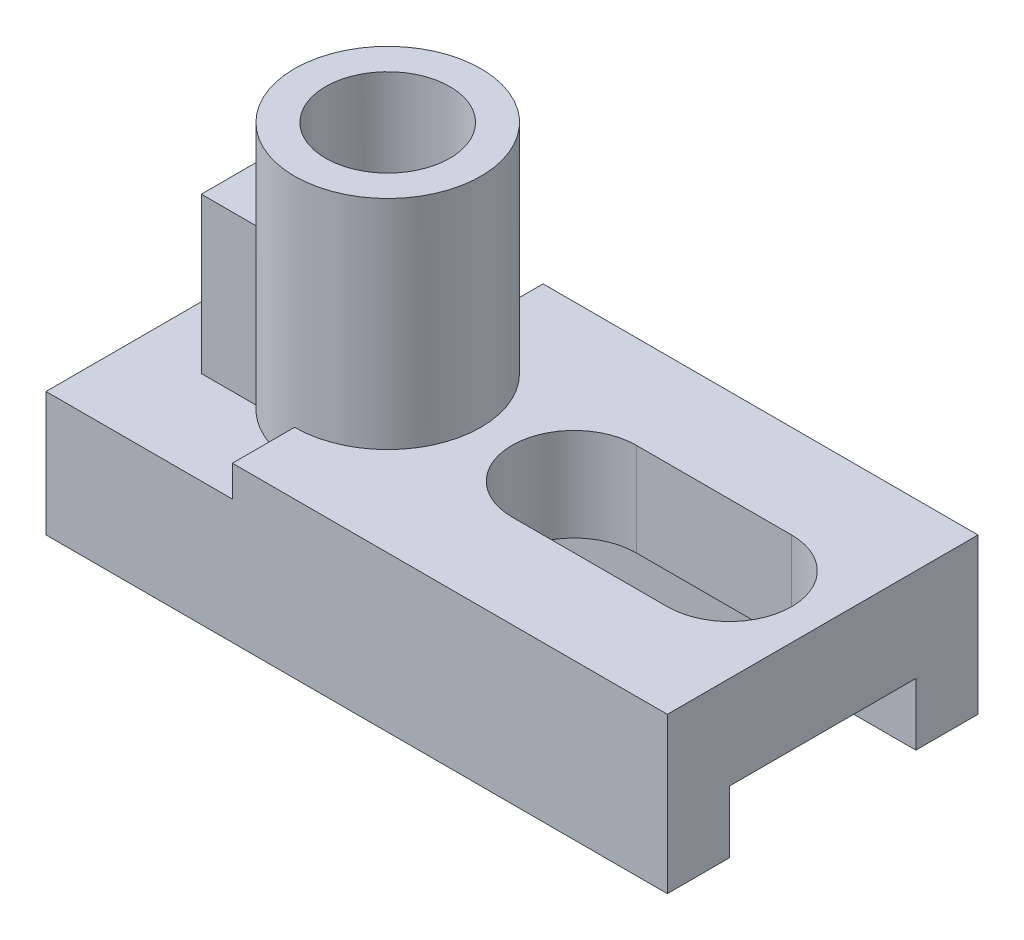
ISO-10303-21;
HEADER;
FILE_DESCRIPTION(('STEP AP214'),'2;1');
FILE_NAME('part.step','',(''),(''),'','','');
FILE_SCHEMA(('AUTOMOTIVE_DESIGN { 1 0 10303 214 1 1 1 1 }'));
ENDSEC;
DATA;
#1=APPLICATION_CONTEXT('core data for automotive mechanical design processes');
#2=APPLICATION_PROTOCOL_DEFINITION('international standard','automotive_design',2000,#1);
#3=PRODUCT_CONTEXT('',#1,'mechanical');
#4=PRODUCT('Part','Part','',(#3));
#5=PRODUCT_RELATED_PRODUCT_CATEGORY('part','',(#4));
#6=PRODUCT_DEFINITION_FORMATION('','',#4);
#7=PRODUCT_DEFINITION_CONTEXT('part definition',#1,'design');
#8=PRODUCT_DEFINITION('design','',#6,#7);
#9=PRODUCT_DEFINITION_SHAPE('','',#8);
#10=(LENGTH_UNIT() NAMED_UNIT(*) SI_UNIT(.MILLI.,.METRE.));
#11=(NAMED_UNIT(*) PLANE_ANGLE_UNIT() SI_UNIT($,.RADIAN.));
#12=(NAMED_UNIT(*) SI_UNIT($,.STERADIAN.) SOLID_ANGLE_UNIT());
#13=UNCERTAINTY_MEASURE_WITH_UNIT(LENGTH_MEASURE(1.E-05),#10,'distance_accuracy_value','');
#14=(GEOMETRIC_REPRESENTATION_CONTEXT(3) GLOBAL_UNCERTAINTY_ASSIGNED_CONTEXT((#13)) GLOBAL_UNIT_ASSIGNED_CONTEXT((#10,
#11,#12)) REPRESENTATION_CONTEXT('',''));
#15=CARTESIAN_POINT('',(0.,0.,0.));
#16=DIRECTION('',(0.,0.,1.));
#17=DIRECTION('',(1.,0.,0.));
#18=AXIS2_PLACEMENT_3D('',#15,#16,#17);
#19=CARTESIAN_POINT('',(30.,25.,25.));
#20=DIRECTION('',(1.,0.,0.));
#21=DIRECTION('',(0.,1.,0.));
#22=AXIS2_PLACEMENT_3D('',#19,#20,#21);
#23=PLANE('',#22);
#24=DIRECTION('',(0.,-1.,0.));
#25=VECTOR('',#24,1.);
#26=CARTESIAN_POINT('',(30.,60.,15.));
#27=LINE('',#26,#25);
#28=CARTESIAN_POINT('',(30.,20.,15.));
#29=VERTEX_POINT('',#28);
#30=CARTESIAN_POINT('',(30.,25.,15.));
#31=VERTEX_POINT('',#30);
#32=EDGE_CURVE('E350',#29,#31,#27,.F.);
#33=ORIENTED_EDGE('',*,*,#32,.F.);
#34=DIRECTION('',(0.,0.,-1.));
#35=VECTOR('',#34,1.);
#36=CARTESIAN_POINT('',(30.,20.,25.));
#37=LINE('',#36,#35);
#38=CARTESIAN_POINT('',(30.,20.,25.));
#39=VERTEX_POINT('',#38);
#40=EDGE_CURVE('E299',#39,#29,#37,.T.);
#41=ORIENTED_EDGE('',*,*,#40,.F.);
#42=DIRECTION('',(0.,-1.,0.));
#43=VECTOR('',#42,1.);
#44=CARTESIAN_POINT('',(30.,25.,25.));
#45=LINE('',#44,#43);
#46=CARTESIAN_POINT('',(30.,25.,25.));
#47=VERTEX_POINT('',#46);
#48=EDGE_CURVE('E324',#47,#39,#45,.T.);
#49=ORIENTED_EDGE('',*,*,#48,.F.);
#50=DIRECTION('',(0.,0.,-1.));
#51=VECTOR('',#50,1.);
#52=CARTESIAN_POINT('',(30.,25.,25.));
#53=LINE('',#52,#51);
#54=EDGE_CURVE('E293',#47,#31,#53,.T.);
#55=ORIENTED_EDGE('',*,*,#54,.T.);
#56=EDGE_LOOP('',(#33,#41,#49,#55));
#57=FACE_BOUND('',#56,.T.);
#58=ADVANCED_FACE('F41',(#57),#23,.F.);
#59=DIRECTION('',(0.,-1.,0.));
#60=VECTOR('',#59,1.);
#61=CARTESIAN_POINT('',(30.,60.,-15.));
#62=LINE('',#61,#60);
#63=CARTESIAN_POINT('',(30.,25.,-15.));
#64=VERTEX_POINT('',#63);
#65=CARTESIAN_POINT('',(30.,20.,-15.));
#66=VERTEX_POINT('',#65);
#67=EDGE_CURVE('E362',#64,#66,#62,.T.);
#68=ORIENTED_EDGE('',*,*,#67,.F.);
#69=CARTESIAN_POINT('',(30.,25.,-25.));
#70=VERTEX_POINT('',#69);
#71=EDGE_CURVE('E298',#64,#70,#53,.T.);
#72=ORIENTED_EDGE('',*,*,#71,.T.);
#73=DIRECTION('',(0.,-1.,0.));
#74=VECTOR('',#73,1.);
#75=CARTESIAN_POINT('',(30.,25.,-25.));
#76=LINE('',#75,#74);
#77=CARTESIAN_POINT('',(30.,20.,-25.));
#78=VERTEX_POINT('',#77);
#79=EDGE_CURVE('E310',#70,#78,#76,.T.);
#80=ORIENTED_EDGE('',*,*,#79,.T.);
#81=EDGE_CURVE('E302',#66,#78,#37,.T.);
#82=ORIENTED_EDGE('',*,*,#81,.F.);
#83=EDGE_LOOP('',(#68,#72,#80,#82));
#84=FACE_BOUND('',#83,.T.);
#85=ADVANCED_FACE('F246',(#84),#23,.F.);
#86=CARTESIAN_POINT('',(0.,0.,25.));
#87=DIRECTION('',(0.,1.,0.));
#88=DIRECTION('',(0.,0.,1.));
#89=AXIS2_PLACEMENT_3D('',#86,#87,#88);
#90=PLANE('',#89);
#91=DIRECTION('',(0.,0.,-1.));
#92=VECTOR('',#91,1.);
#93=CARTESIAN_POINT('',(100.,0.,25.));
#94=LINE('',#93,#92);
#95=CARTESIAN_POINT('',(100.,0.,-15.));
#96=VERTEX_POINT('',#95);
#97=CARTESIAN_POINT('',(100.,0.,-25.));
#98=VERTEX_POINT('',#97);
#99=EDGE_CURVE('E282',#96,#98,#94,.T.);
#100=ORIENTED_EDGE('',*,*,#99,.F.);
#101=DIRECTION('',(-1.,0.,0.));
#102=VECTOR('',#101,1.);
#103=CARTESIAN_POINT('',(100.,0.,-15.));
#104=LINE('',#103,#102);
#105=CARTESIAN_POINT('',(0.,0.,-15.));
#106=VERTEX_POINT('',#105);
#107=EDGE_CURVE('E283',#96,#106,#104,.T.);
#108=ORIENTED_EDGE('',*,*,#107,.T.);
#109=DIRECTION('',(0.,0.,-1.));
#110=VECTOR('',#109,1.);
#111=CARTESIAN_POINT('',(0.,0.,25.));
#112=LINE('',#111,#110);
#113=CARTESIAN_POINT('',(0.,0.,-25.));
#114=VERTEX_POINT('',#113);
#115=EDGE_CURVE('E49',#106,#114,#112,.T.);
#116=ORIENTED_EDGE('',*,*,#115,.T.);
#117=DIRECTION('',(1.,0.,0.));
#118=VECTOR('',#117,1.);
#119=CARTESIAN_POINT('',(0.,0.,-25.));
#120=LINE('',#119,#118);
#121=EDGE_CURVE('E286',#114,#98,#120,.T.);
#122=ORIENTED_EDGE('',*,*,#121,.T.);
#123=EDGE_LOOP('',(#100,#108,#116,#122));
#124=FACE_BOUND('',#123,.T.);
#125=ADVANCED_FACE('F253',(#124),#90,.F.);
#126=CARTESIAN_POINT('',(0.,20.,25.));
#127=DIRECTION('',(1.,0.,0.));
#128=DIRECTION('',(0.,1.,0.));
#129=AXIS2_PLACEMENT_3D('',#126,#127,#128);
#130=PLANE('',#129);
#131=ORIENTED_EDGE('',*,*,#115,.F.);
#132=DIRECTION('',(0.,-1.,0.));
#133=VECTOR('',#132,1.);
#134=CARTESIAN_POINT('',(0.,0.,-15.));
#135=LINE('',#134,#133);
#136=CARTESIAN_POINT('',(0.,10.,-15.));
#137=VERTEX_POINT('',#136);
#138=EDGE_CURVE('E348',#137,#106,#135,.T.);
#139=ORIENTED_EDGE('',*,*,#138,.F.);
#140=DIRECTION('',(0.,0.,-1.));
#141=VECTOR('',#140,1.);
#142=CARTESIAN_POINT('',(0.,10.,-15.));
#143=LINE('',#142,#141);
#144=CARTESIAN_POINT('',(0.,10.,15.));
#145=VERTEX_POINT('',#144);
#146=EDGE_CURVE('E341',#145,#137,#143,.T.);
#147=ORIENTED_EDGE('',*,*,#146,.F.);
#148=DIRECTION('',(0.,1.,0.));
#149=VECTOR('',#148,1.);
#150=CARTESIAN_POINT('',(0.,0.,15.));
#151=LINE('',#150,#149);
#152=CARTESIAN_POINT('',(0.,0.,15.));
#153=VERTEX_POINT('',#152);
#154=EDGE_CURVE('E345',#153,#145,#151,.T.);
#155=ORIENTED_EDGE('',*,*,#154,.F.);
#156=CARTESIAN_POINT('',(0.,0.,25.));
#157=VERTEX_POINT('',#156);
#158=EDGE_CURVE('E11',#157,#153,#112,.T.);
#159=ORIENTED_EDGE('',*,*,#158,.F.);
#160=DIRECTION('',(0.,-1.,0.));
#161=VECTOR('',#160,1.);
#162=CARTESIAN_POINT('',(0.,20.,25.));
#163=LINE('',#162,#161);
#164=CARTESIAN_POINT('',(0.,20.,25.));
#165=VERTEX_POINT('',#164);
#166=EDGE_CURVE('E309',#165,#157,#163,.T.);
#167=ORIENTED_EDGE('',*,*,#166,.F.);
#168=DIRECTION('',(0.,0.,-1.));
#169=VECTOR('',#168,1.);
#170=CARTESIAN_POINT('',(0.,20.,25.));
#171=LINE('',#170,#169);
#172=CARTESIAN_POINT('',(0.,20.,-25.));
#173=VERTEX_POINT('',#172);
#174=EDGE_CURVE('E303',#165,#173,#171,.T.);
#175=ORIENTED_EDGE('',*,*,#174,.T.);
#176=DIRECTION('',(0.,-1.,0.));
#177=VECTOR('',#176,1.);
#178=CARTESIAN_POINT('',(0.,20.,-25.));
#179=LINE('',#178,#177);
#180=EDGE_CURVE('E319',#173,#114,#179,.T.);
#181=ORIENTED_EDGE('',*,*,#180,.T.);
#182=EDGE_LOOP('',(#131,#139,#147,#155,#159,#167,#175,#181));
#183=FACE_BOUND('',#182,.T.);
#184=ADVANCED_FACE('F43',(#183),#130,.F.);
#185=ORIENTED_EDGE('',*,*,#158,.T.);
#186=DIRECTION('',(-1.,0.,0.));
#187=VECTOR('',#186,1.);
#188=CARTESIAN_POINT('',(100.,0.,15.));
#189=LINE('',#188,#187);
#190=CARTESIAN_POINT('',(100.,0.,15.));
#191=VERTEX_POINT('',#190);
#192=EDGE_CURVE('E335',#191,#153,#189,.T.);
#193=ORIENTED_EDGE('',*,*,#192,.F.);
#194=CARTESIAN_POINT('',(100.,0.,25.));
#195=VERTEX_POINT('',#194);
#196=EDGE_CURVE('E289',#195,#191,#94,.T.);
#197=ORIENTED_EDGE('',*,*,#196,.F.);
#198=DIRECTION('',(1.,0.,0.));
#199=VECTOR('',#198,1.);
#200=CARTESIAN_POINT('',(0.,0.,25.));
#201=LINE('',#200,#199);
#202=EDGE_CURVE('E330',#157,#195,#201,.T.);
#203=ORIENTED_EDGE('',*,*,#202,.F.);
#204=EDGE_LOOP('',(#185,#193,#197,#203));
#205=FACE_BOUND('',#204,.T.);
#206=ADVANCED_FACE('F266',(#205),#90,.F.);
#207=CARTESIAN_POINT('',(100.,0.,25.));
#208=DIRECTION('',(-1.,0.,0.));
#209=DIRECTION('',(0.,0.,1.));
#210=AXIS2_PLACEMENT_3D('',#207,#208,#209);
#211=PLANE('',#210);
#212=DIRECTION('',(0.,0.,-1.));
#213=VECTOR('',#212,1.);
#214=CARTESIAN_POINT('',(100.,10.,-15.));
#215=LINE('',#214,#213);
#216=CARTESIAN_POINT('',(100.,10.,15.));
#217=VERTEX_POINT('',#216);
#218=CARTESIAN_POINT('',(100.,10.,-15.));
#219=VERTEX_POINT('',#218);
#220=EDGE_CURVE('E336',#217,#219,#215,.T.);
#221=ORIENTED_EDGE('',*,*,#220,.T.);
#222=DIRECTION('',(0.,-1.,0.));
#223=VECTOR('',#222,1.);
#224=CARTESIAN_POINT('',(100.,0.,-15.));
#225=LINE('',#224,#223);
#226=EDGE_CURVE('E344',#219,#96,#225,.T.);
#227=ORIENTED_EDGE('',*,*,#226,.T.);
#228=ORIENTED_EDGE('',*,*,#99,.T.);
#229=DIRECTION('',(0.,1.,0.));
#230=VECTOR('',#229,1.);
#231=CARTESIAN_POINT('',(100.,0.,-25.));
#232=LINE('',#231,#230);
#233=CARTESIAN_POINT('',(100.,25.,-25.));
#234=VERTEX_POINT('',#233);
#235=EDGE_CURVE('E316',#98,#234,#232,.T.);
#236=ORIENTED_EDGE('',*,*,#235,.T.);
#237=DIRECTION('',(0.,0.,-1.));
#238=VECTOR('',#237,1.);
#239=CARTESIAN_POINT('',(100.,25.,25.));
#240=LINE('',#239,#238);
#241=CARTESIAN_POINT('',(100.,25.,25.));
#242=VERTEX_POINT('',#241);
#243=EDGE_CURVE('E290',#242,#234,#240,.T.);
#244=ORIENTED_EDGE('',*,*,#243,.F.);
#245=DIRECTION('',(0.,1.,0.));
#246=VECTOR('',#245,1.);
#247=CARTESIAN_POINT('',(100.,0.,25.));
#248=LINE('',#247,#246);
#249=EDGE_CURVE('E328',#195,#242,#248,.T.);
#250=ORIENTED_EDGE('',*,*,#249,.F.);
#251=ORIENTED_EDGE('',*,*,#196,.T.);
#252=DIRECTION('',(0.,1.,0.));
#253=VECTOR('',#252,1.);
#254=CARTESIAN_POINT('',(100.,0.,15.));
#255=LINE('',#254,#253);
#256=EDGE_CURVE('E353',#191,#217,#255,.T.);
#257=ORIENTED_EDGE('',*,*,#256,.T.);
#258=EDGE_LOOP('',(#221,#227,#228,#236,#244,#250,#251,#257));
#259=FACE_BOUND('',#258,.T.);
#260=ADVANCED_FACE('F263',(#259),#211,.F.);
#261=CARTESIAN_POINT('',(100.,25.,25.));
#262=DIRECTION('',(0.,-1.,0.));
#263=DIRECTION('',(1.,0.,0.));
#264=AXIS2_PLACEMENT_3D('',#261,#262,#263);
#265=PLANE('',#264);
#266=DIRECTION('',(1.,0.,0.));
#267=VECTOR('',#266,1.);
#268=CARTESIAN_POINT('',(60.,25.,10.));
#269=LINE('',#268,#267);
#270=CARTESIAN_POINT('',(60.,25.,10.));
#271=VERTEX_POINT('',#270);
#272=CARTESIAN_POINT('',(85.,25.,10.));
#273=VERTEX_POINT('',#272);
#274=EDGE_CURVE('E200',#271,#273,#269,.T.);
#275=ORIENTED_EDGE('',*,*,#274,.F.);
#276=CARTESIAN_POINT('',(60.,25.,0.));
#277=DIRECTION('',(0.,1.,0.));
#278=DIRECTION('',(-1.,0.,0.));
#279=AXIS2_PLACEMENT_3D('',#276,#277,#278);
#280=CIRCLE('',#279,10.);
#281=CARTESIAN_POINT('',(60.,25.,-10.));
#282=VERTEX_POINT('',#281);
#283=EDGE_CURVE('E56',#282,#271,#280,.T.);
#284=ORIENTED_EDGE('',*,*,#283,.F.);
#285=DIRECTION('',(-1.,0.,0.));
#286=VECTOR('',#285,1.);
#287=CARTESIAN_POINT('',(60.,25.,-10.));
#288=LINE('',#287,#286);
#289=CARTESIAN_POINT('',(85.,25.,-10.));
#290=VERTEX_POINT('',#289);
#291=EDGE_CURVE('E186',#290,#282,#288,.T.);
#292=ORIENTED_EDGE('',*,*,#291,.F.);
#293=CARTESIAN_POINT('',(85.,25.,0.));
#294=DIRECTION('',(0.,1.,0.));
#295=DIRECTION('',(-1.,0.,0.));
#296=AXIS2_PLACEMENT_3D('',#293,#294,#295);
#297=CIRCLE('',#296,10.);
#298=EDGE_CURVE('E206',#273,#290,#297,.T.);
#299=ORIENTED_EDGE('',*,*,#298,.F.);
#300=EDGE_LOOP('',(#275,#284,#292,#299));
#301=FACE_BOUND('',#300,.T.);
#302=CARTESIAN_POINT('',(30.,25.,0.));
#303=DIRECTION('',(0.,-1.,0.));
#304=DIRECTION('',(1.,0.,0.));
#305=AXIS2_PLACEMENT_3D('',#302,#303,#304);
#306=CIRCLE('',#305,15.);
#307=EDGE_CURVE('E359',#31,#64,#306,.F.);
#308=ORIENTED_EDGE('',*,*,#307,.F.);
#309=ORIENTED_EDGE('',*,*,#54,.F.);
#310=DIRECTION('',(-1.,0.,0.));
#311=VECTOR('',#310,1.);
#312=CARTESIAN_POINT('',(100.,25.,25.));
#313=LINE('',#312,#311);
#314=EDGE_CURVE('E326',#242,#47,#313,.T.);
#315=ORIENTED_EDGE('',*,*,#314,.F.);
#316=ORIENTED_EDGE('',*,*,#243,.T.);
#317=DIRECTION('',(-1.,0.,0.));
#318=VECTOR('',#317,1.);
#319=CARTESIAN_POINT('',(100.,25.,-25.));
#320=LINE('',#319,#318);
#321=EDGE_CURVE('E313',#234,#70,#320,.T.);
#322=ORIENTED_EDGE('',*,*,#321,.T.);
#323=ORIENTED_EDGE('',*,*,#71,.F.);
#324=EDGE_LOOP('',(#308,#309,#315,#316,#322,#323));
#325=FACE_BOUND('',#324,.T.);
#326=ADVANCED_FACE('F260',(#301,#325),#265,.F.);
#327=CARTESIAN_POINT('',(30.,20.,25.));
#328=DIRECTION('',(0.,-1.,0.));
#329=DIRECTION('',(1.,0.,0.));
#330=AXIS2_PLACEMENT_3D('',#327,#328,#329);
#331=PLANE('',#330);
#332=DIRECTION('',(0.,0.,1.));
#333=VECTOR('',#332,1.);
#334=CARTESIAN_POINT('',(10.,20.,-10.));
#335=LINE('',#334,#333);
#336=CARTESIAN_POINT('',(10.,20.,-10.));
#337=VERTEX_POINT('',#336);
#338=CARTESIAN_POINT('',(10.,20.,10.));
#339=VERTEX_POINT('',#338);
#340=EDGE_CURVE('E397',#337,#339,#335,.T.);
#341=ORIENTED_EDGE('',*,*,#340,.F.);
#342=DIRECTION('',(-1.,0.,0.));
#343=VECTOR('',#342,1.);
#344=CARTESIAN_POINT('',(100.001,20.,-10.));
#345=LINE('',#344,#343);
#346=CARTESIAN_POINT('',(18.8196601125011,20.,-10.));
#347=VERTEX_POINT('',#346);
#348=EDGE_CURVE('E390',#347,#337,#345,.T.);
#349=ORIENTED_EDGE('',*,*,#348,.F.);
#350=CARTESIAN_POINT('',(30.,20.,0.));
#351=DIRECTION('',(0.,-1.,0.));
#352=DIRECTION('',(1.,0.,0.));
#353=AXIS2_PLACEMENT_3D('',#350,#351,#352);
#354=CIRCLE('',#353,15.);
#355=EDGE_CURVE('E371',#66,#347,#354,.F.);
#356=ORIENTED_EDGE('',*,*,#355,.F.);
#357=ORIENTED_EDGE('',*,*,#81,.T.);
#358=DIRECTION('',(-1.,0.,0.));
#359=VECTOR('',#358,1.);
#360=CARTESIAN_POINT('',(30.,20.,-25.));
#361=LINE('',#360,#359);
#362=EDGE_CURVE('E307',#78,#173,#361,.T.);
#363=ORIENTED_EDGE('',*,*,#362,.T.);
#364=ORIENTED_EDGE('',*,*,#174,.F.);
#365=DIRECTION('',(-1.,0.,0.));
#366=VECTOR('',#365,1.);
#367=CARTESIAN_POINT('',(30.,20.,25.));
#368=LINE('',#367,#366);
#369=EDGE_CURVE('E306',#39,#165,#368,.T.);
#370=ORIENTED_EDGE('',*,*,#369,.F.);
#371=ORIENTED_EDGE('',*,*,#40,.T.);
#372=CARTESIAN_POINT('',(18.8196601125011,20.,9.99999999999999));
#373=VERTEX_POINT('',#372);
#374=EDGE_CURVE('E374',#373,#29,#354,.F.);
#375=ORIENTED_EDGE('',*,*,#374,.F.);
#376=DIRECTION('',(-1.,0.,0.));
#377=VECTOR('',#376,1.);
#378=CARTESIAN_POINT('',(100.001,20.,10.));
#379=LINE('',#378,#377);
#380=EDGE_CURVE('E378',#373,#339,#379,.T.);
#381=ORIENTED_EDGE('',*,*,#380,.T.);
#382=EDGE_LOOP('',(#341,#349,#356,#357,#363,#364,#370,#371,#375,#381));
#383=FACE_BOUND('',#382,.T.);
#384=ADVANCED_FACE('F258',(#383),#331,.F.);
#385=CARTESIAN_POINT('',(0.,0.,25.));
#386=DIRECTION('',(0.,0.,1.));
#387=DIRECTION('',(1.,0.,0.));
#388=AXIS2_PLACEMENT_3D('',#385,#386,#387);
#389=PLANE('',#388);
#390=ORIENTED_EDGE('',*,*,#166,.T.);
#391=ORIENTED_EDGE('',*,*,#202,.T.);
#392=ORIENTED_EDGE('',*,*,#249,.T.);
#393=ORIENTED_EDGE('',*,*,#314,.T.);
#394=ORIENTED_EDGE('',*,*,#48,.T.);
#395=ORIENTED_EDGE('',*,*,#369,.T.);
#396=EDGE_LOOP('',(#390,#391,#392,#393,#394,#395));
#397=FACE_BOUND('',#396,.T.);
#398=ADVANCED_FACE('F435',(#397),#389,.T.);
#399=CARTESIAN_POINT('',(0.,0.,-25.));
#400=DIRECTION('',(0.,0.,1.));
#401=DIRECTION('',(1.,0.,0.));
#402=AXIS2_PLACEMENT_3D('',#399,#400,#401);
#403=PLANE('',#402);
#404=ORIENTED_EDGE('',*,*,#180,.F.);
#405=ORIENTED_EDGE('',*,*,#362,.F.);
#406=ORIENTED_EDGE('',*,*,#79,.F.);
#407=ORIENTED_EDGE('',*,*,#321,.F.);
#408=ORIENTED_EDGE('',*,*,#235,.F.);
#409=ORIENTED_EDGE('',*,*,#121,.F.);
#410=EDGE_LOOP('',(#404,#405,#406,#407,#408,#409));
#411=FACE_BOUND('',#410,.T.);
#412=ADVANCED_FACE('F428',(#411),#403,.F.);
#413=CARTESIAN_POINT('',(100.,0.,-15.));
#414=DIRECTION('',(0.,0.,-1.));
#415=DIRECTION('',(-1.,0.,0.));
#416=AXIS2_PLACEMENT_3D('',#413,#414,#415);
#417=PLANE('',#416);
#418=ORIENTED_EDGE('',*,*,#138,.T.);
#419=ORIENTED_EDGE('',*,*,#107,.F.);
#420=ORIENTED_EDGE('',*,*,#226,.F.);
#421=DIRECTION('',(-1.,0.,0.));
#422=VECTOR('',#421,1.);
#423=CARTESIAN_POINT('',(100.,10.,-15.));
#424=LINE('',#423,#422);
#425=EDGE_CURVE('E322',#219,#137,#424,.T.);
#426=ORIENTED_EDGE('',*,*,#425,.T.);
#427=EDGE_LOOP('',(#418,#419,#420,#426));
#428=FACE_BOUND('',#427,.T.);
#429=ADVANCED_FACE('F468',(#428),#417,.F.);
#430=CARTESIAN_POINT('',(100.,10.,-15.));
#431=DIRECTION('',(0.,1.,0.));
#432=DIRECTION('',(-1.,0.,0.));
#433=AXIS2_PLACEMENT_3D('',#430,#431,#432);
#434=PLANE('',#433);
#435=DIRECTION('',(1.,0.,0.));
#436=VECTOR('',#435,1.);
#437=CARTESIAN_POINT('',(60.,10.,-10.));
#438=LINE('',#437,#436);
#439=CARTESIAN_POINT('',(60.,10.,-10.));
#440=VERTEX_POINT('',#439);
#441=CARTESIAN_POINT('',(85.,10.,-10.));
#442=VERTEX_POINT('',#441);
#443=EDGE_CURVE('E198',#440,#442,#438,.T.);
#444=ORIENTED_EDGE('',*,*,#443,.F.);
#445=CARTESIAN_POINT('',(60.,10.,0.));
#446=DIRECTION('',(0.,1.,0.));
#447=DIRECTION('',(-1.,0.,0.));
#448=AXIS2_PLACEMENT_3D('',#445,#446,#447);
#449=CIRCLE('',#448,10.);
#450=CARTESIAN_POINT('',(60.,10.,10.));
#451=VERTEX_POINT('',#450);
#452=EDGE_CURVE('E180',#451,#440,#449,.F.);
#453=ORIENTED_EDGE('',*,*,#452,.F.);
#454=DIRECTION('',(-1.,0.,0.));
#455=VECTOR('',#454,1.);
#456=CARTESIAN_POINT('',(60.,10.,10.));
#457=LINE('',#456,#455);
#458=CARTESIAN_POINT('',(85.,10.,10.));
#459=VERTEX_POINT('',#458);
#460=EDGE_CURVE('E189',#459,#451,#457,.T.);
#461=ORIENTED_EDGE('',*,*,#460,.F.);
#462=CARTESIAN_POINT('',(85.,10.,0.));
#463=DIRECTION('',(0.,1.,0.));
#464=DIRECTION('',(-1.,0.,0.));
#465=AXIS2_PLACEMENT_3D('',#462,#463,#464);
#466=CIRCLE('',#465,10.);
#467=EDGE_CURVE('E64',#442,#459,#466,.F.);
#468=ORIENTED_EDGE('',*,*,#467,.F.);
#469=EDGE_LOOP('',(#444,#453,#461,#468));
#470=FACE_BOUND('',#469,.T.);
#471=CARTESIAN_POINT('',(30.,10.,0.));
#472=DIRECTION('',(0.,1.,0.));
#473=DIRECTION('',(-1.,0.,0.));
#474=AXIS2_PLACEMENT_3D('',#471,#472,#473);
#475=CIRCLE('',#474,10.);
#476=CARTESIAN_POINT('',(20.,10.,0.));
#477=VERTEX_POINT('',#476);
#478=EDGE_CURVE('E375',#477,#477,#475,.T.);
#479=ORIENTED_EDGE('',*,*,#478,.T.);
#480=EDGE_LOOP('',(#479));
#481=FACE_BOUND('',#480,.T.);
#482=ORIENTED_EDGE('',*,*,#146,.T.);
#483=ORIENTED_EDGE('',*,*,#425,.F.);
#484=ORIENTED_EDGE('',*,*,#220,.F.);
#485=DIRECTION('',(-1.,0.,0.));
#486=VECTOR('',#485,1.);
#487=CARTESIAN_POINT('',(100.,10.,15.));
#488=LINE('',#487,#486);
#489=EDGE_CURVE('E338',#217,#145,#488,.T.);
#490=ORIENTED_EDGE('',*,*,#489,.T.);
#491=EDGE_LOOP('',(#482,#483,#484,#490));
#492=FACE_BOUND('',#491,.T.);
#493=ADVANCED_FACE('F195',(#470,#481,#492),#434,.F.);
#494=CARTESIAN_POINT('',(100.,0.,15.));
#495=DIRECTION('',(0.,0.,1.));
#496=DIRECTION('',(1.,0.,0.));
#497=AXIS2_PLACEMENT_3D('',#494,#495,#496);
#498=PLANE('',#497);
#499=ORIENTED_EDGE('',*,*,#154,.T.);
#500=ORIENTED_EDGE('',*,*,#489,.F.);
#501=ORIENTED_EDGE('',*,*,#256,.F.);
#502=ORIENTED_EDGE('',*,*,#192,.T.);
#503=EDGE_LOOP('',(#499,#500,#501,#502));
#504=FACE_BOUND('',#503,.T.);
#505=ADVANCED_FACE('F464',(#504),#498,.F.);
#506=CARTESIAN_POINT('',(30.,60.,0.));
#507=DIRECTION('',(0.,-1.,0.));
#508=DIRECTION('',(1.,0.,0.));
#509=AXIS2_PLACEMENT_3D('',#506,#507,#508);
#510=CYLINDRICAL_SURFACE('',#509,15.);
#511=CARTESIAN_POINT('',(30.,60.,0.));
#512=DIRECTION('',(0.,1.,0.));
#513=DIRECTION('',(-1.,0.,0.));
#514=AXIS2_PLACEMENT_3D('',#511,#512,#513);
#515=CIRCLE('',#514,15.);
#516=CARTESIAN_POINT('',(15.,60.,0.));
#517=VERTEX_POINT('',#516);
#518=EDGE_CURVE('E365',#517,#517,#515,.T.);
#519=ORIENTED_EDGE('',*,*,#518,.F.);
#520=EDGE_LOOP('',(#519));
#521=FACE_BOUND('',#520,.T.);
#522=ORIENTED_EDGE('',*,*,#355,.T.);
#523=DIRECTION('',(0.,-1.,0.));
#524=VECTOR('',#523,1.);
#525=CARTESIAN_POINT('',(18.819660112501,60.,-10.));
#526=LINE('',#525,#524);
#527=CARTESIAN_POINT('',(18.819660112501,45.,-10.));
#528=VERTEX_POINT('',#527);
#529=EDGE_CURVE('E218',#528,#347,#526,.T.);
#530=ORIENTED_EDGE('',*,*,#529,.F.);
#531=CARTESIAN_POINT('',(30.,45.,0.));
#532=DIRECTION('',(0.,1.,0.));
#533=DIRECTION('',(-1.,0.,0.));
#534=AXIS2_PLACEMENT_3D('',#531,#532,#533);
#535=CIRCLE('',#534,15.);
#536=CARTESIAN_POINT('',(18.819660112501,45.,10.));
#537=VERTEX_POINT('',#536);
#538=EDGE_CURVE('E387',#537,#528,#535,.F.);
#539=ORIENTED_EDGE('',*,*,#538,.F.);
#540=DIRECTION('',(0.,-1.,0.));
#541=VECTOR('',#540,1.);
#542=CARTESIAN_POINT('',(18.819660112501,60.,10.));
#543=LINE('',#542,#541);
#544=EDGE_CURVE('E384',#373,#537,#543,.F.);
#545=ORIENTED_EDGE('',*,*,#544,.F.);
#546=ORIENTED_EDGE('',*,*,#374,.T.);
#547=ORIENTED_EDGE('',*,*,#32,.T.);
#548=ORIENTED_EDGE('',*,*,#307,.T.);
#549=ORIENTED_EDGE('',*,*,#67,.T.);
#550=EDGE_LOOP('',(#522,#530,#539,#545,#546,#547,#548,#549));
#551=FACE_BOUND('',#550,.T.);
#552=ADVANCED_FACE('F417',(#521,#551),#510,.T.);
#553=CARTESIAN_POINT('',(30.,60.,0.));
#554=DIRECTION('',(0.,-1.,0.));
#555=DIRECTION('',(1.,0.,0.));
#556=AXIS2_PLACEMENT_3D('',#553,#554,#555);
#557=CYLINDRICAL_SURFACE('',#556,10.);
#558=CARTESIAN_POINT('',(21.3397459621556,32.5,5.));
#559=CARTESIAN_POINT('',(21.3397451717148,32.6303316567961,4.99999937774203));
#560=CARTESIAN_POINT('',(21.3367936067945,32.7606749083469,4.99489703999514));
#561=CARTESIAN_POINT('',(21.3250978442011,33.0203552182528,4.97455590140419));
#562=CARTESIAN_POINT('',(21.3163509497667,33.1496917797997,4.95931238151411));
#563=CARTESIAN_POINT('',(21.2933708761722,33.4065135375637,4.91885673177676));
#564=CARTESIAN_POINT('',(21.2791290941027,33.533995503785,4.89362896878987));
#565=CARTESIAN_POINT('',(21.2456753377062,33.7860174644883,4.83352579766962));
#566=CARTESIAN_POINT('',(21.2264612023273,33.910556154035,4.79864619425836));
#567=CARTESIAN_POINT('',(21.1625432276779,34.2771112075341,4.6805346614708));
#568=CARTESIAN_POINT('',(21.1114011902248,34.5137323207336,4.58356144574886));
#569=CARTESIAN_POINT('',(20.9978634005828,34.9671619547889,4.35632594214357));
#570=CARTESIAN_POINT('',(20.9354670396361,35.1839694029475,4.22606185336435));
#571=CARTESIAN_POINT('',(20.80015967177,35.6115106177474,3.92334549410418));
#572=CARTESIAN_POINT('',(20.7268058966527,35.8202685823228,3.74829976483493));
#573=CARTESIAN_POINT('',(20.5813917776511,36.2070690515488,3.36622943427775));
#574=CARTESIAN_POINT('',(20.5093320949016,36.3850962349664,3.15918897852744));
#575=CARTESIAN_POINT('',(20.4051555690493,36.6312264286858,2.82033206345808));
#576=CARTESIAN_POINT('',(20.3700644551257,36.7119131521005,2.69838192133586));
#577=CARTESIAN_POINT('',(20.3031984331087,36.8626286654218,2.44722131237054));
#578=CARTESIAN_POINT('',(20.2714222067019,36.9326616973628,2.31801376345376));
#579=CARTESIAN_POINT('',(20.2121047956838,37.0613762312931,2.05317391777884));
#580=CARTESIAN_POINT('',(20.1845625204856,37.1200606574798,1.91754328730049));
#581=CARTESIAN_POINT('',(20.1345275763493,37.2254310158281,1.64079696990288));
#582=CARTESIAN_POINT('',(20.1120343710895,37.2721182224333,1.49968186742446));
#583=CARTESIAN_POINT('',(20.0741964005329,37.3500155125182,1.22330436599561));
#584=CARTESIAN_POINT('',(20.0584570426482,37.3820901096035,1.08833937324157));
#585=CARTESIAN_POINT('',(20.0323842841448,37.4349664286038,0.815709188800226));
#586=CARTESIAN_POINT('',(20.0220503571985,37.4557692480603,0.678044261360672));
#587=CARTESIAN_POINT('',(20.0070909976274,37.4858199114167,0.401217055741373));
#588=CARTESIAN_POINT('',(20.0024628094897,37.4950733329762,0.262055533104025));
#589=CARTESIAN_POINT('',(19.9990431871666,37.5019143333983,-0.016622041628056));
#590=CARTESIAN_POINT('',(20.0002513958802,37.4995026259935,-0.15613807151017));
#591=CARTESIAN_POINT('',(20.0081073689446,37.4837693970487,-0.422158287145504));
#592=CARTESIAN_POINT('',(20.0142712780748,37.4714182292176,-0.548735568605425));
#593=CARTESIAN_POINT('',(20.0312788492895,37.437167427645,-0.80031234857486));
#594=CARTESIAN_POINT('',(20.0421239889958,37.415264778974,-0.925311336065679));
#595=CARTESIAN_POINT('',(20.0682326356399,37.3621537757626,-1.17280363036128));
#596=CARTESIAN_POINT('',(20.0834946645095,37.3309485341379,-1.29529776073402));
#597=CARTESIAN_POINT('',(20.1180784487973,37.2595523484822,-1.53706747687733));
#598=CARTESIAN_POINT('',(20.1374017589985,37.2193579627522,-1.65634181022019));
#599=CARTESIAN_POINT('',(20.2014077760755,37.0846254604358,-2.01140340124727));
#600=CARTESIAN_POINT('',(20.2517737794168,36.9766310411066,-2.24122720645223));
#601=CARTESIAN_POINT('',(20.3631218462743,36.7286703075067,-2.67992393299636));
#602=CARTESIAN_POINT('',(20.4241077086267,36.588692546844,-2.88878931500038));
#603=CARTESIAN_POINT('',(20.5577764311311,36.2655365262267,-3.30085071454948));
#604=CARTESIAN_POINT('',(20.6310200432075,36.0795253968794,-3.50164452019891));
#605=CARTESIAN_POINT('',(20.7772941382291,35.6770108060787,-3.87054772569916));
#606=CARTESIAN_POINT('',(20.8503244150107,35.4604841030917,-4.03863197852248));
#607=CARTESIAN_POINT('',(20.9560908822458,35.1088064627185,-4.2679539578839));
#608=CARTESIAN_POINT('',(20.9917002251846,34.9829490688498,-4.34240098162072));
#609=CARTESIAN_POINT('',(21.0594851604287,34.7244861217296,-4.48030007564995));
#610=CARTESIAN_POINT('',(21.09166219668,34.5918834411214,-4.54375677655288));
#611=CARTESIAN_POINT('',(21.1513936855708,34.3207965096454,-4.65901104656178));
#612=CARTESIAN_POINT('',(21.1789509347442,34.1823158810192,-4.71081567564999));
#613=CARTESIAN_POINT('',(21.2283515576381,33.9003786539485,-4.80217514780264));
#614=CARTESIAN_POINT('',(21.2501957104144,33.7569227369748,-4.84173166119403));
#615=CARTESIAN_POINT('',(21.2857382854019,33.4777430649249,-4.90539138118897));
#616=CARTESIAN_POINT('',(21.2999446715175,33.3423062664424,-4.93047005719824));
#617=CARTESIAN_POINT('',(21.3221178334045,33.0693280921951,-4.96939299432912));
#618=CARTESIAN_POINT('',(21.3300853742938,32.9317869766089,-4.98323863305272));
#619=CARTESIAN_POINT('',(21.3394397976437,32.6558845075408,-4.99947854378905));
#620=CARTESIAN_POINT('',(21.3408304384998,32.51752366777,-5.00187935599941));
#621=CARTESIAN_POINT('',(21.3369807746226,32.2411790950675,-4.99520900229025));
#622=CARTESIAN_POINT('',(21.3317409174746,32.1031953373112,-4.98613861072294));
#623=CARTESIAN_POINT('',(21.315784948067,31.8439119206006,-4.95828928039379));
#624=CARTESIAN_POINT('',(21.3057330086067,31.7224432856653,-4.94068517767344));
#625=CARTESIAN_POINT('',(21.2808950136088,31.4815824240837,-4.89671673345791));
#626=CARTESIAN_POINT('',(21.2661074999668,31.3621908489265,-4.87034969372092));
#627=CARTESIAN_POINT('',(21.2153039257381,31.0082899585571,-4.77850297980869));
#628=CARTESIAN_POINT('',(21.1728354536974,30.7778857081681,-4.7002591459757));
#629=CARTESIAN_POINT('',(21.0731875839911,30.3229067643173,-4.50823244687957));
#630=CARTESIAN_POINT('',(21.0154179457053,30.0990963080479,-4.39297142446301));
#631=CARTESIAN_POINT('',(20.8921939172236,29.6726622544196,-4.1314342135104));
#632=CARTESIAN_POINT('',(20.8267355870988,29.4700496209225,-3.98514209244361));
#633=CARTESIAN_POINT('',(20.6856020423109,29.0651085963624,-3.64419701683804));
#634=CARTESIAN_POINT('',(20.6096790613894,28.8660355161201,-3.44577250062109));
#635=CARTESIAN_POINT('',(20.4632800292305,28.5029175331527,-3.0169763223897));
#636=CARTESIAN_POINT('',(20.3928058230241,28.3388844626049,-2.78659391213234));
#637=CARTESIAN_POINT('',(20.2958058138552,28.1209905262288,-2.41774074756937));
#638=CARTESIAN_POINT('',(20.2645707871158,28.0523379001797,-2.28903769990886));
#639=CARTESIAN_POINT('',(20.2063228866794,27.926243481346,-2.02535752273873));
#640=CARTESIAN_POINT('',(20.1793081439919,27.8687967231238,-1.89038320507349));
#641=CARTESIAN_POINT('',(20.1303105997796,27.7657820915435,-1.61516754079526));
#642=CARTESIAN_POINT('',(20.1083253986965,27.7202085521106,-1.47492874316053));
#643=CARTESIAN_POINT('',(20.0700491132156,27.6414909239825,-1.19024723850079));
#644=CARTESIAN_POINT('',(20.0537573536171,27.6083453613854,-1.0458050321719));
#645=CARTESIAN_POINT('',(20.0286006816083,27.5574049663759,-0.767401441682143));
#646=CARTESIAN_POINT('',(20.0191913437359,27.5384803973572,-0.633694933854998));
#647=CARTESIAN_POINT('',(20.0057552192549,27.5115065468183,-0.364924207537143));
#648=CARTESIAN_POINT('',(20.0017280167756,27.5034564250429,-0.22986009475945));
#649=CARTESIAN_POINT('',(19.9991685468539,27.4983368228188,0.0404881253987143));
#650=CARTESIAN_POINT('',(20.000634680202,27.5012641466372,0.175772157294879));
#651=CARTESIAN_POINT('',(20.009016667339,27.5180525477526,0.44548523948911));
#652=CARTESIAN_POINT('',(20.0159323711015,27.5319133240524,0.579914313221422));
#653=CARTESIAN_POINT('',(20.034391290649,27.5691176794173,0.838004211928017));
#654=CARTESIAN_POINT('',(20.0455978973033,27.5917728342268,0.961788818118164));
#655=CARTESIAN_POINT('',(20.0723268201018,27.6462131555377,1.20687032491422));
#656=CARTESIAN_POINT('',(20.0878505104696,27.6780012293566,1.32816642014825));
#657=CARTESIAN_POINT('',(20.140387046236,27.7866082442713,1.68709586409474));
#658=CARTESIAN_POINT('',(20.1833818239467,27.8767019250861,1.91998814282436));
#659=CARTESIAN_POINT('',(20.2837056726556,28.0936422217195,2.37715486497024));
#660=CARTESIAN_POINT('',(20.3415691761619,28.2218959654493,2.60063468941493));
#661=CARTESIAN_POINT('',(20.4655933067902,28.5097903051846,3.02386422902505));
#662=CARTESIAN_POINT('',(20.531757739671,28.669445317032,3.22360297720278));
#663=CARTESIAN_POINT('',(20.6735672153127,29.0339751711068,3.61456788757425));
#664=CARTESIAN_POINT('',(20.7495004598367,29.2417690335459,3.80296860888284));
#665=CARTESIAN_POINT('',(20.8968557898813,29.6872970477145,4.14333626823683));
#666=CARTESIAN_POINT('',(20.9682738435464,29.9250574065678,4.29527097306548));
#667=CARTESIAN_POINT('',(21.0665870894545,30.3042196667176,4.49442606762734));
#668=CARTESIAN_POINT('',(21.0983130153169,30.436626328209,4.55675683233958));
#669=CARTESIAN_POINT('',(21.1571202779586,30.7072554637669,4.66985426801939));
#670=CARTESIAN_POINT('',(21.1842040050885,30.8454748987939,4.72062689492349));
#671=CARTESIAN_POINT('',(21.2325797414129,31.1264078742926,4.80987708806143));
#672=CARTESIAN_POINT('',(21.2538866288515,31.2691087930855,4.8483862843261));
#673=CARTESIAN_POINT('',(21.2898521522596,31.5580921444705,4.91270711070743));
#674=CARTESIAN_POINT('',(21.3045154358883,31.7043719976095,4.93852761851021));
#675=CARTESIAN_POINT('',(21.3235245888864,31.9589978869293,4.97182308032502));
#676=CARTESIAN_POINT('',(21.3295928054749,32.0668242162268,4.98237929832923));
#677=CARTESIAN_POINT('',(21.3377039556326,32.2830976599821,4.99646825199979));
#678=CARTESIAN_POINT('',(21.3397466199191,32.3915448154826,5.00000051781052));
#679=CARTESIAN_POINT('',(21.3397459621556,32.5,5.));
#680=B_SPLINE_CURVE_WITH_KNOTS('',3,(#558,#559,#560,#561,#562,#563,#564,#565,#566,#567,#568,
#569,#570,#571,#572,#573,#574,#575,#576,#577,#578,#579,#580,#581,#582,#583,#584,#585,#586,#587,
#588,#589,#590,#591,#592,#593,#594,#595,#596,#597,#598,#599,#600,#601,#602,#603,#604,#605,#606,
#607,#608,#609,#610,#611,#612,#613,#614,#615,#616,#617,#618,#619,#620,#621,#622,#623,#624,#625,
#626,#627,#628,#629,#630,#631,#632,#633,#634,#635,#636,#637,#638,#639,#640,#641,#642,#643,#644,
#645,#646,#647,#648,#649,#650,#651,#652,#653,#654,#655,#656,#657,#658,#659,#660,#661,#662,#663,
#664,#665,#666,#667,#668,#669,#670,#671,#672,#673,#674,#675,#676,#677,#678,#679),.UNSPECIFIED.,
.T.,.F.,(4,2,2,2,2,2,2,2,2,2,2,2,2,2,2,2,2,2,2,2,2,2,2,2,2,2,2,2,2,2,2,2,2,2,2,2,2,2,2,2,2,2,2,
2,2,2,2,2,2,2,2,2,2,2,2,2,2,2,2,2,4),(0.,0.390882384556478,0.781946787673771,1.17362595011563,
1.56547562833135,2.34415414386116,3.12287479153473,3.96582272680015,4.80918971852754,
5.25982992442625,5.7102902243025,6.16063429887936,6.61093051439734,7.02920538093651,
7.44743951241414,7.86547158389038,8.28347807833436,8.66500933177613,9.04666110301429,
9.42818530565608,9.80985583438832,10.5829669450729,11.3563551760292,12.2028497813491,
13.0499926207968,13.501002097322,13.9518210829089,14.4023661773263,14.8528498019288,
15.2676702585959,15.6824398346428,16.0969723603126,16.5114769048702,16.8804871114428,
17.2496110473148,17.9873544979167,18.7592666964179,19.5315761871159,20.4012390551442,
21.2711951250237,21.7182117808489,22.1650299066984,22.6116344121698,23.0581859356052,
23.4637505264203,23.8692837779652,24.2746989806128,24.6801030225936,25.0586722294313,
25.4373620814588,26.1940875134848,26.9831783738577,27.7726323429201,28.6406529303875,
29.5094379801419,29.9581473751206,30.4066250230036,30.8539364017616,31.3009343703532,
31.6261844795329,31.9514563450476),.UNSPECIFIED.);
#681=CARTESIAN_POINT('',(21.3397459621556,32.5,5.));
#682=VERTEX_POINT('',#681);
#683=EDGE_CURVE('E192',#682,#682,#680,.T.);
#684=ORIENTED_EDGE('',*,*,#683,.T.);
#685=EDGE_LOOP('',(#684));
#686=FACE_BOUND('',#685,.T.);
#687=CARTESIAN_POINT('',(30.,60.,0.));
#688=DIRECTION('',(0.,1.,0.));
#689=DIRECTION('',(-1.,0.,0.));
#690=AXIS2_PLACEMENT_3D('',#687,#688,#689);
#691=CIRCLE('',#690,10.);
#692=CARTESIAN_POINT('',(20.,60.,0.));
#693=VERTEX_POINT('',#692);
#694=EDGE_CURVE('E368',#693,#693,#691,.T.);
#695=ORIENTED_EDGE('',*,*,#694,.T.);
#696=EDGE_LOOP('',(#695));
#697=FACE_BOUND('',#696,.T.);
#698=ORIENTED_EDGE('',*,*,#478,.F.);
#699=EDGE_LOOP('',(#698));
#700=FACE_BOUND('',#699,.T.);
#701=ADVANCED_FACE('F456',(#686,#697,#700),#557,.F.);
#702=CARTESIAN_POINT('',(30.,60.,0.));
#703=DIRECTION('',(0.,1.,0.));
#704=DIRECTION('',(-1.,0.,0.));
#705=AXIS2_PLACEMENT_3D('',#702,#703,#704);
#706=PLANE('',#705);
#707=ORIENTED_EDGE('',*,*,#518,.T.);
#708=EDGE_LOOP('',(#707));
#709=FACE_BOUND('',#708,.T.);
#710=ORIENTED_EDGE('',*,*,#694,.F.);
#711=EDGE_LOOP('',(#710));
#712=FACE_BOUND('',#711,.T.);
#713=ADVANCED_FACE('F455',(#709,#712),#706,.T.);
#714=CARTESIAN_POINT('',(100.001,20.,-10.));
#715=DIRECTION('',(0.,0.,-1.));
#716=DIRECTION('',(-1.,0.,0.));
#717=AXIS2_PLACEMENT_3D('',#714,#715,#716);
#718=PLANE('',#717);
#719=DIRECTION('',(-1.,0.,0.));
#720=VECTOR('',#719,1.);
#721=CARTESIAN_POINT('',(100.001,45.,-10.));
#722=LINE('',#721,#720);
#723=CARTESIAN_POINT('',(10.,45.,-10.));
#724=VERTEX_POINT('',#723);
#725=EDGE_CURVE('E385',#528,#724,#722,.T.);
#726=ORIENTED_EDGE('',*,*,#725,.F.);
#727=ORIENTED_EDGE('',*,*,#529,.T.);
#728=ORIENTED_EDGE('',*,*,#348,.T.);
#729=DIRECTION('',(0.,-1.,0.));
#730=VECTOR('',#729,1.);
#731=CARTESIAN_POINT('',(10.,20.,-10.));
#732=LINE('',#731,#730);
#733=EDGE_CURVE('E381',#724,#337,#732,.T.);
#734=ORIENTED_EDGE('',*,*,#733,.F.);
#735=EDGE_LOOP('',(#726,#727,#728,#734));
#736=FACE_BOUND('',#735,.T.);
#737=ADVANCED_FACE('F412',(#736),#718,.T.);
#738=CARTESIAN_POINT('',(100.001,45.,-10.));
#739=DIRECTION('',(0.,1.,0.));
#740=DIRECTION('',(-1.,0.,0.));
#741=AXIS2_PLACEMENT_3D('',#738,#739,#740);
#742=PLANE('',#741);
#743=DIRECTION('',(-1.,0.,0.));
#744=VECTOR('',#743,1.);
#745=CARTESIAN_POINT('',(100.001,45.,10.));
#746=LINE('',#745,#744);
#747=CARTESIAN_POINT('',(10.,45.,10.));
#748=VERTEX_POINT('',#747);
#749=EDGE_CURVE('E382',#537,#748,#746,.T.);
#750=ORIENTED_EDGE('',*,*,#749,.F.);
#751=ORIENTED_EDGE('',*,*,#538,.T.);
#752=ORIENTED_EDGE('',*,*,#725,.T.);
#753=DIRECTION('',(0.,0.,-1.));
#754=VECTOR('',#753,1.);
#755=CARTESIAN_POINT('',(10.,45.,-10.));
#756=LINE('',#755,#754);
#757=EDGE_CURVE('E226',#748,#724,#756,.T.);
#758=ORIENTED_EDGE('',*,*,#757,.F.);
#759=EDGE_LOOP('',(#750,#751,#752,#758));
#760=FACE_BOUND('',#759,.T.);
#761=ADVANCED_FACE('F408',(#760),#742,.T.);
#762=CARTESIAN_POINT('',(100.001,20.,10.));
#763=DIRECTION('',(0.,0.,1.));
#764=DIRECTION('',(1.,0.,0.));
#765=AXIS2_PLACEMENT_3D('',#762,#763,#764);
#766=PLANE('',#765);
#767=ORIENTED_EDGE('',*,*,#380,.F.);
#768=ORIENTED_EDGE('',*,*,#544,.T.);
#769=ORIENTED_EDGE('',*,*,#749,.T.);
#770=DIRECTION('',(0.,1.,0.));
#771=VECTOR('',#770,1.);
#772=CARTESIAN_POINT('',(10.,20.,10.));
#773=LINE('',#772,#771);
#774=EDGE_CURVE('E399',#339,#748,#773,.T.);
#775=ORIENTED_EDGE('',*,*,#774,.F.);
#776=EDGE_LOOP('',(#767,#768,#769,#775));
#777=FACE_BOUND('',#776,.T.);
#778=ADVANCED_FACE('F442',(#777),#766,.T.);
#779=CARTESIAN_POINT('',(10.,0.,0.));
#780=DIRECTION('',(1.,0.,0.));
#781=DIRECTION('',(0.,0.,-1.));
#782=AXIS2_PLACEMENT_3D('',#779,#780,#781);
#783=PLANE('',#782);
#784=CARTESIAN_POINT('',(10.,32.5,0.));
#785=DIRECTION('',(-1.,0.,0.));
#786=DIRECTION('',(0.,0.,1.));
#787=AXIS2_PLACEMENT_3D('',#784,#785,#786);
#788=CIRCLE('',#787,5.);
#789=CARTESIAN_POINT('',(10.,32.5,5.));
#790=VERTEX_POINT('',#789);
#791=EDGE_CURVE('E215',#790,#790,#788,.T.);
#792=ORIENTED_EDGE('',*,*,#791,.F.);
#793=EDGE_LOOP('',(#792));
#794=FACE_BOUND('',#793,.T.);
#795=ORIENTED_EDGE('',*,*,#733,.T.);
#796=ORIENTED_EDGE('',*,*,#340,.T.);
#797=ORIENTED_EDGE('',*,*,#774,.T.);
#798=ORIENTED_EDGE('',*,*,#757,.T.);
#799=EDGE_LOOP('',(#795,#796,#797,#798));
#800=FACE_BOUND('',#799,.T.);
#801=ADVANCED_FACE('F404',(#794,#800),#783,.F.);
#802=CARTESIAN_POINT('',(100.001,32.5,0.));
#803=DIRECTION('',(-1.,0.,0.));
#804=DIRECTION('',(0.,0.,1.));
#805=AXIS2_PLACEMENT_3D('',#802,#803,#804);
#806=CYLINDRICAL_SURFACE('',#805,5.);
#807=ORIENTED_EDGE('',*,*,#683,.F.);
#808=EDGE_LOOP('',(#807));
#809=FACE_BOUND('',#808,.T.);
#810=ORIENTED_EDGE('',*,*,#791,.T.);
#811=EDGE_LOOP('',(#810));
#812=FACE_BOUND('',#811,.T.);
#813=ADVANCED_FACE('F228',(#809,#812),#806,.F.);
#814=CARTESIAN_POINT('',(60.,-0.00100000000001141,0.));
#815=DIRECTION('',(0.,1.,0.));
#816=DIRECTION('',(-1.,0.,0.));
#817=AXIS2_PLACEMENT_3D('',#814,#815,#816);
#818=CYLINDRICAL_SURFACE('',#817,10.);
#819=ORIENTED_EDGE('',*,*,#452,.T.);
#820=DIRECTION('',(0.,1.,0.));
#821=VECTOR('',#820,1.);
#822=CARTESIAN_POINT('',(60.,-0.00100000000001141,-10.));
#823=LINE('',#822,#821);
#824=EDGE_CURVE('E193',#440,#282,#823,.T.);
#825=ORIENTED_EDGE('',*,*,#824,.T.);
#826=ORIENTED_EDGE('',*,*,#283,.T.);
#827=DIRECTION('',(0.,1.,0.));
#828=VECTOR('',#827,1.);
#829=CARTESIAN_POINT('',(60.,-0.00100000000001141,10.));
#830=LINE('',#829,#828);
#831=EDGE_CURVE('E176',#451,#271,#830,.T.);
#832=ORIENTED_EDGE('',*,*,#831,.F.);
#833=EDGE_LOOP('',(#819,#825,#826,#832));
#834=FACE_BOUND('',#833,.T.);
#835=ADVANCED_FACE('F178',(#834),#818,.F.);
#836=CARTESIAN_POINT('',(60.,-0.00100000000001141,-10.));
#837=DIRECTION('',(0.,0.,-1.));
#838=DIRECTION('',(-1.,0.,0.));
#839=AXIS2_PLACEMENT_3D('',#836,#837,#838);
#840=PLANE('',#839);
#841=ORIENTED_EDGE('',*,*,#443,.T.);
#842=DIRECTION('',(0.,1.,0.));
#843=VECTOR('',#842,1.);
#844=CARTESIAN_POINT('',(85.,-0.00100000000000447,-10.));
#845=LINE('',#844,#843);
#846=EDGE_CURVE('E212',#442,#290,#845,.T.);
#847=ORIENTED_EDGE('',*,*,#846,.T.);
#848=ORIENTED_EDGE('',*,*,#291,.T.);
#849=ORIENTED_EDGE('',*,*,#824,.F.);
#850=EDGE_LOOP('',(#841,#847,#848,#849));
#851=FACE_BOUND('',#850,.T.);
#852=ADVANCED_FACE('F235',(#851),#840,.F.);
#853=CARTESIAN_POINT('',(85.,-0.00100000000000447,0.));
#854=DIRECTION('',(0.,1.,0.));
#855=DIRECTION('',(-1.,0.,0.));
#856=AXIS2_PLACEMENT_3D('',#853,#854,#855);
#857=CYLINDRICAL_SURFACE('',#856,10.);
#858=ORIENTED_EDGE('',*,*,#467,.T.);
#859=DIRECTION('',(0.,1.,0.));
#860=VECTOR('',#859,1.);
#861=CARTESIAN_POINT('',(85.,-0.00100000000000447,10.));
#862=LINE('',#861,#860);
#863=EDGE_CURVE('E185',#459,#273,#862,.T.);
#864=ORIENTED_EDGE('',*,*,#863,.T.);
#865=ORIENTED_EDGE('',*,*,#298,.T.);
#866=ORIENTED_EDGE('',*,*,#846,.F.);
#867=EDGE_LOOP('',(#858,#864,#865,#866));
#868=FACE_BOUND('',#867,.T.);
#869=ADVANCED_FACE('F238',(#868),#857,.F.);
#870=CARTESIAN_POINT('',(60.,-0.00100000000001141,10.));
#871=DIRECTION('',(0.,0.,1.));
#872=DIRECTION('',(1.,0.,0.));
#873=AXIS2_PLACEMENT_3D('',#870,#871,#872);
#874=PLANE('',#873);
#875=ORIENTED_EDGE('',*,*,#460,.T.);
#876=ORIENTED_EDGE('',*,*,#831,.T.);
#877=ORIENTED_EDGE('',*,*,#274,.T.);
#878=ORIENTED_EDGE('',*,*,#863,.F.);
#879=EDGE_LOOP('',(#875,#876,#877,#878));
#880=FACE_BOUND('',#879,.T.);
#881=ADVANCED_FACE('F190',(#880),#874,.F.);
#882=CLOSED_SHELL('',(#58,#85,#125,#184,#206,#260,#326,#384,#398,#412,#429,#493,#505,#552,#701,
#713,#737,#761,#778,#801,#813,#835,#852,#869,#881));
#883=MANIFOLD_SOLID_BREP('B2',#882);
#884=ADVANCED_BREP_SHAPE_REPRESENTATION('',(#18,#883),#14);
#885=SHAPE_DEFINITION_REPRESENTATION(#9,#884);
ENDSEC;
END-ISO-10303-21;
